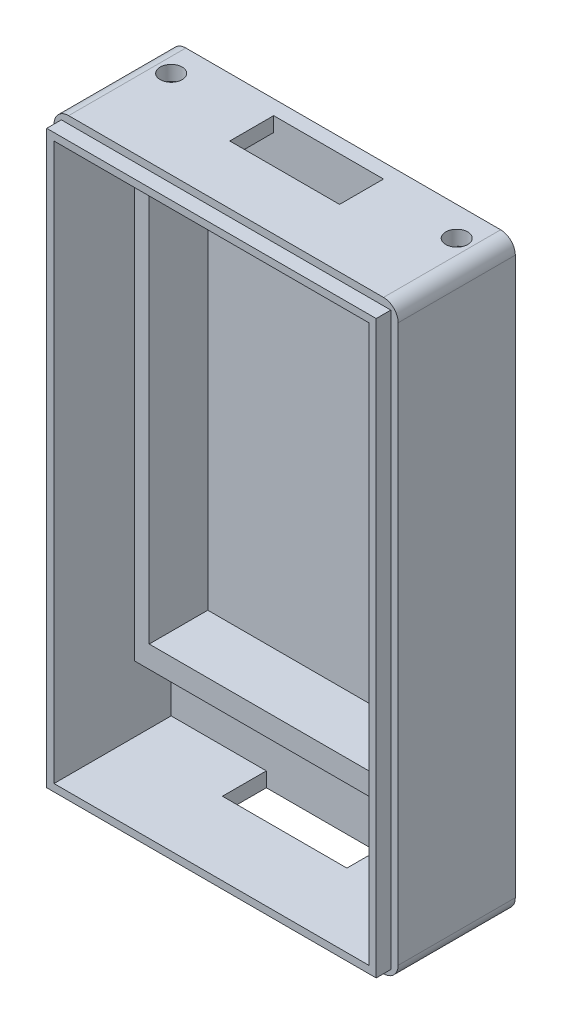
ISO-10303-21;
HEADER;
FILE_DESCRIPTION(('STEP AP214'),'2;1');
FILE_NAME('part.step','',(''),(''),'','','');
FILE_SCHEMA(('AUTOMOTIVE_DESIGN { 1 0 10303 214 1 1 1 1 }'));
ENDSEC;
DATA;
#1=APPLICATION_CONTEXT('core data for automotive mechanical design processes');
#2=APPLICATION_PROTOCOL_DEFINITION('international standard','automotive_design',2000,#1);
#3=PRODUCT_CONTEXT('',#1,'mechanical');
#4=PRODUCT('Part','Part','',(#3));
#5=PRODUCT_RELATED_PRODUCT_CATEGORY('part','',(#4));
#6=PRODUCT_DEFINITION_FORMATION('','',#4);
#7=PRODUCT_DEFINITION_CONTEXT('part definition',#1,'design');
#8=PRODUCT_DEFINITION('design','',#6,#7);
#9=PRODUCT_DEFINITION_SHAPE('','',#8);
#10=(LENGTH_UNIT() NAMED_UNIT(*) SI_UNIT(.MILLI.,.METRE.));
#11=(NAMED_UNIT(*) PLANE_ANGLE_UNIT() SI_UNIT($,.RADIAN.));
#12=(NAMED_UNIT(*) SI_UNIT($,.STERADIAN.) SOLID_ANGLE_UNIT());
#13=UNCERTAINTY_MEASURE_WITH_UNIT(LENGTH_MEASURE(1.E-05),#10,'distance_accuracy_value','');
#14=(GEOMETRIC_REPRESENTATION_CONTEXT(3) GLOBAL_UNCERTAINTY_ASSIGNED_CONTEXT((#13)) GLOBAL_UNIT_ASSIGNED_CONTEXT((#10,
#11,#12)) REPRESENTATION_CONTEXT('',''));
#15=CARTESIAN_POINT('',(0.,0.,0.));
#16=DIRECTION('',(0.,0.,1.));
#17=DIRECTION('',(1.,0.,0.));
#18=AXIS2_PLACEMENT_3D('',#15,#16,#17);
#19=CARTESIAN_POINT('',(23.5,40.,18.));
#20=DIRECTION('',(-1.,0.,0.));
#21=DIRECTION('',(0.,-1.,0.));
#22=AXIS2_PLACEMENT_3D('',#19,#20,#21);
#23=PLANE('',#22);
#24=DIRECTION('',(0.,1.,0.));
#25=VECTOR('',#24,1.);
#26=CARTESIAN_POINT('',(23.5,-40.,16.));
#27=LINE('',#26,#25);
#28=CARTESIAN_POINT('',(23.5,-38.,16.));
#29=VERTEX_POINT('',#28);
#30=CARTESIAN_POINT('',(23.5,38.,16.));
#31=VERTEX_POINT('',#30);
#32=EDGE_CURVE('E365',#29,#31,#27,.T.);
#33=ORIENTED_EDGE('',*,*,#32,.F.);
#34=DIRECTION('',(0.,0.,-1.));
#35=VECTOR('',#34,1.);
#36=CARTESIAN_POINT('',(23.5,-38.,18.));
#37=LINE('',#36,#35);
#38=CARTESIAN_POINT('',(23.5,-38.,0.));
#39=VERTEX_POINT('',#38);
#40=EDGE_CURVE('E522',#29,#39,#37,.T.);
#41=ORIENTED_EDGE('',*,*,#40,.T.);
#42=DIRECTION('',(0.,1.,0.));
#43=VECTOR('',#42,1.);
#44=CARTESIAN_POINT('',(23.5,40.,0.));
#45=LINE('',#44,#43);
#46=CARTESIAN_POINT('',(23.5,38.,0.));
#47=VERTEX_POINT('',#46);
#48=EDGE_CURVE('E474',#39,#47,#45,.T.);
#49=ORIENTED_EDGE('',*,*,#48,.T.);
#50=DIRECTION('',(0.,0.,-1.));
#51=VECTOR('',#50,1.);
#52=CARTESIAN_POINT('',(23.5,38.,18.));
#53=LINE('',#52,#51);
#54=EDGE_CURVE('E520',#47,#31,#53,.F.);
#55=ORIENTED_EDGE('',*,*,#54,.T.);
#56=EDGE_LOOP('',(#33,#41,#49,#55));
#57=FACE_BOUND('',#56,.T.);
#58=ADVANCED_FACE('F37',(#57),#23,.F.);
#59=CARTESIAN_POINT('',(-23.5,40.,18.));
#60=DIRECTION('',(0.,-1.,0.));
#61=DIRECTION('',(0.,0.,-1.));
#62=AXIS2_PLACEMENT_3D('',#59,#60,#61);
#63=PLANE('',#62);
#64=CARTESIAN_POINT('',(-19.5,40.,4.));
#65=DIRECTION('',(0.,1.,0.));
#66=DIRECTION('',(0.,0.,1.));
#67=AXIS2_PLACEMENT_3D('',#64,#65,#66);
#68=CIRCLE('',#67,1.5);
#69=CARTESIAN_POINT('',(-19.5,40.,5.5));
#70=VERTEX_POINT('',#69);
#71=EDGE_CURVE('E317',#70,#70,#68,.T.);
#72=ORIENTED_EDGE('',*,*,#71,.F.);
#73=EDGE_LOOP('',(#72));
#74=FACE_BOUND('',#73,.T.);
#75=CARTESIAN_POINT('',(19.5,40.,4.));
#76=DIRECTION('',(0.,1.,0.));
#77=DIRECTION('',(0.,0.,-1.));
#78=AXIS2_PLACEMENT_3D('',#75,#76,#77);
#79=CIRCLE('',#78,1.5);
#80=CARTESIAN_POINT('',(19.5,40.,2.5));
#81=VERTEX_POINT('',#80);
#82=EDGE_CURVE('E320',#81,#81,#79,.T.);
#83=ORIENTED_EDGE('',*,*,#82,.F.);
#84=EDGE_LOOP('',(#83));
#85=FACE_BOUND('',#84,.T.);
#86=DIRECTION('',(-1.,0.,0.));
#87=VECTOR('',#86,1.);
#88=CARTESIAN_POINT('',(-23.5,40.,8.));
#89=LINE('',#88,#87);
#90=CARTESIAN_POINT('',(7.5,40.,8.));
#91=VERTEX_POINT('',#90);
#92=CARTESIAN_POINT('',(-7.5,40.,8.));
#93=VERTEX_POINT('',#92);
#94=EDGE_CURVE('E497',#91,#93,#89,.T.);
#95=ORIENTED_EDGE('',*,*,#94,.T.);
#96=DIRECTION('',(0.,0.,-1.));
#97=VECTOR('',#96,1.);
#98=CARTESIAN_POINT('',(-7.5,40.,18.));
#99=LINE('',#98,#97);
#100=CARTESIAN_POINT('',(-7.5,40.,2.));
#101=VERTEX_POINT('',#100);
#102=EDGE_CURVE('E500',#93,#101,#99,.T.);
#103=ORIENTED_EDGE('',*,*,#102,.T.);
#104=DIRECTION('',(1.,0.,0.));
#105=VECTOR('',#104,1.);
#106=CARTESIAN_POINT('',(-23.5,40.,2.));
#107=LINE('',#106,#105);
#108=CARTESIAN_POINT('',(7.5,40.,2.));
#109=VERTEX_POINT('',#108);
#110=EDGE_CURVE('E491',#101,#109,#107,.T.);
#111=ORIENTED_EDGE('',*,*,#110,.T.);
#112=DIRECTION('',(0.,0.,1.));
#113=VECTOR('',#112,1.);
#114=CARTESIAN_POINT('',(7.5,40.,18.));
#115=LINE('',#114,#113);
#116=EDGE_CURVE('E494',#109,#91,#115,.T.);
#117=ORIENTED_EDGE('',*,*,#116,.T.);
#118=EDGE_LOOP('',(#95,#103,#111,#117));
#119=FACE_BOUND('',#118,.T.);
#120=DIRECTION('',(-1.,0.,0.));
#121=VECTOR('',#120,1.);
#122=CARTESIAN_POINT('',(-23.5,40.,0.));
#123=LINE('',#122,#121);
#124=CARTESIAN_POINT('',(21.5,40.,0.));
#125=VERTEX_POINT('',#124);
#126=CARTESIAN_POINT('',(-21.5,40.,0.));
#127=VERTEX_POINT('',#126);
#128=EDGE_CURVE('E483',#125,#127,#123,.T.);
#129=ORIENTED_EDGE('',*,*,#128,.T.);
#130=DIRECTION('',(0.,0.,-1.));
#131=VECTOR('',#130,1.);
#132=CARTESIAN_POINT('',(-21.5,40.,18.));
#133=LINE('',#132,#131);
#134=CARTESIAN_POINT('',(-21.5,40.,16.));
#135=VERTEX_POINT('',#134);
#136=EDGE_CURVE('E11',#127,#135,#133,.F.);
#137=ORIENTED_EDGE('',*,*,#136,.T.);
#138=DIRECTION('',(-1.,0.,0.));
#139=VECTOR('',#138,1.);
#140=CARTESIAN_POINT('',(-23.5,40.,16.));
#141=LINE('',#140,#139);
#142=CARTESIAN_POINT('',(21.5,40.,16.));
#143=VERTEX_POINT('',#142);
#144=EDGE_CURVE('E368',#143,#135,#141,.T.);
#145=ORIENTED_EDGE('',*,*,#144,.F.);
#146=DIRECTION('',(0.,0.,-1.));
#147=VECTOR('',#146,1.);
#148=CARTESIAN_POINT('',(21.5,40.,18.));
#149=LINE('',#148,#147);
#150=EDGE_CURVE('E45',#143,#125,#149,.T.);
#151=ORIENTED_EDGE('',*,*,#150,.T.);
#152=EDGE_LOOP('',(#129,#137,#145,#151));
#153=FACE_BOUND('',#152,.T.);
#154=ADVANCED_FACE('F553',(#74,#85,#119,#153),#63,.F.);
#155=CARTESIAN_POINT('',(-23.5,40.,18.));
#156=DIRECTION('',(1.,0.,0.));
#157=DIRECTION('',(0.,1.,0.));
#158=AXIS2_PLACEMENT_3D('',#155,#156,#157);
#159=PLANE('',#158);
#160=DIRECTION('',(0.,-1.,0.));
#161=VECTOR('',#160,1.);
#162=CARTESIAN_POINT('',(-23.5,40.,0.));
#163=LINE('',#162,#161);
#164=CARTESIAN_POINT('',(-23.5,38.,0.));
#165=VERTEX_POINT('',#164);
#166=CARTESIAN_POINT('',(-23.5,-38.,0.));
#167=VERTEX_POINT('',#166);
#168=EDGE_CURVE('E486',#165,#167,#163,.T.);
#169=ORIENTED_EDGE('',*,*,#168,.T.);
#170=DIRECTION('',(0.,0.,-1.));
#171=VECTOR('',#170,1.);
#172=CARTESIAN_POINT('',(-23.5,-38.,18.));
#173=LINE('',#172,#171);
#174=CARTESIAN_POINT('',(-23.5,-38.,16.));
#175=VERTEX_POINT('',#174);
#176=EDGE_CURVE('E52',#167,#175,#173,.F.);
#177=ORIENTED_EDGE('',*,*,#176,.T.);
#178=DIRECTION('',(0.,-1.,0.));
#179=VECTOR('',#178,1.);
#180=CARTESIAN_POINT('',(-23.5,-40.,16.));
#181=LINE('',#180,#179);
#182=CARTESIAN_POINT('',(-23.5,38.,16.));
#183=VERTEX_POINT('',#182);
#184=EDGE_CURVE('E370',#183,#175,#181,.T.);
#185=ORIENTED_EDGE('',*,*,#184,.F.);
#186=DIRECTION('',(0.,0.,-1.));
#187=VECTOR('',#186,1.);
#188=CARTESIAN_POINT('',(-23.5,38.,18.));
#189=LINE('',#188,#187);
#190=EDGE_CURVE('E545',#183,#165,#189,.T.);
#191=ORIENTED_EDGE('',*,*,#190,.T.);
#192=EDGE_LOOP('',(#169,#177,#185,#191));
#193=FACE_BOUND('',#192,.T.);
#194=ADVANCED_FACE('F564',(#193),#159,.F.);
#195=CARTESIAN_POINT('',(-23.5,-40.,18.));
#196=DIRECTION('',(0.,1.,0.));
#197=DIRECTION('',(0.,0.,1.));
#198=AXIS2_PLACEMENT_3D('',#195,#196,#197);
#199=PLANE('',#198);
#200=DIRECTION('',(-1.,0.,0.));
#201=VECTOR('',#200,1.);
#202=CARTESIAN_POINT('',(-23.5,-40.,2.));
#203=LINE('',#202,#201);
#204=CARTESIAN_POINT('',(8.50000000000001,-40.,2.));
#205=VERTEX_POINT('',#204);
#206=CARTESIAN_POINT('',(-8.49999999999999,-40.,2.));
#207=VERTEX_POINT('',#206);
#208=EDGE_CURVE('E307',#205,#207,#203,.T.);
#209=ORIENTED_EDGE('',*,*,#208,.T.);
#210=DIRECTION('',(0.,0.,1.));
#211=VECTOR('',#210,1.);
#212=CARTESIAN_POINT('',(-8.49999999999999,-40.,18.));
#213=LINE('',#212,#211);
#214=CARTESIAN_POINT('',(-8.49999999999999,-40.,8.));
#215=VERTEX_POINT('',#214);
#216=EDGE_CURVE('E310',#207,#215,#213,.T.);
#217=ORIENTED_EDGE('',*,*,#216,.T.);
#218=DIRECTION('',(1.,0.,0.));
#219=VECTOR('',#218,1.);
#220=CARTESIAN_POINT('',(-23.5,-40.,8.));
#221=LINE('',#220,#219);
#222=CARTESIAN_POINT('',(8.50000000000001,-40.,8.));
#223=VERTEX_POINT('',#222);
#224=EDGE_CURVE('E303',#215,#223,#221,.T.);
#225=ORIENTED_EDGE('',*,*,#224,.T.);
#226=DIRECTION('',(0.,0.,-1.));
#227=VECTOR('',#226,1.);
#228=CARTESIAN_POINT('',(8.50000000000001,-40.,18.));
#229=LINE('',#228,#227);
#230=EDGE_CURVE('E279',#223,#205,#229,.T.);
#231=ORIENTED_EDGE('',*,*,#230,.T.);
#232=EDGE_LOOP('',(#209,#217,#225,#231));
#233=FACE_BOUND('',#232,.T.);
#234=DIRECTION('',(1.,0.,0.));
#235=VECTOR('',#234,1.);
#236=CARTESIAN_POINT('',(-23.5,-40.,0.));
#237=LINE('',#236,#235);
#238=CARTESIAN_POINT('',(-21.5,-40.,0.));
#239=VERTEX_POINT('',#238);
#240=CARTESIAN_POINT('',(21.5,-40.,0.));
#241=VERTEX_POINT('',#240);
#242=EDGE_CURVE('E488',#239,#241,#237,.T.);
#243=ORIENTED_EDGE('',*,*,#242,.T.);
#244=DIRECTION('',(0.,0.,-1.));
#245=VECTOR('',#244,1.);
#246=CARTESIAN_POINT('',(21.5,-40.,18.));
#247=LINE('',#246,#245);
#248=CARTESIAN_POINT('',(21.5,-40.,16.));
#249=VERTEX_POINT('',#248);
#250=EDGE_CURVE('E536',#241,#249,#247,.F.);
#251=ORIENTED_EDGE('',*,*,#250,.T.);
#252=DIRECTION('',(1.,0.,0.));
#253=VECTOR('',#252,1.);
#254=CARTESIAN_POINT('',(-23.5,-40.,16.));
#255=LINE('',#254,#253);
#256=CARTESIAN_POINT('',(-21.5,-40.,16.));
#257=VERTEX_POINT('',#256);
#258=EDGE_CURVE('E356',#257,#249,#255,.T.);
#259=ORIENTED_EDGE('',*,*,#258,.F.);
#260=DIRECTION('',(0.,0.,-1.));
#261=VECTOR('',#260,1.);
#262=CARTESIAN_POINT('',(-21.5,-40.,18.));
#263=LINE('',#262,#261);
#264=EDGE_CURVE('E533',#257,#239,#263,.T.);
#265=ORIENTED_EDGE('',*,*,#264,.T.);
#266=EDGE_LOOP('',(#243,#251,#259,#265));
#267=FACE_BOUND('',#266,.T.);
#268=ADVANCED_FACE('F573',(#233,#267),#199,.F.);
#269=CARTESIAN_POINT('',(0.,0.,18.));
#270=DIRECTION('',(0.,0.,1.));
#271=DIRECTION('',(1.,0.,0.));
#272=AXIS2_PLACEMENT_3D('',#269,#270,#271);
#273=PLANE('',#272);
#274=DIRECTION('',(0.,1.,0.));
#275=VECTOR('',#274,1.);
#276=CARTESIAN_POINT('',(21.5,38.,18.));
#277=LINE('',#276,#275);
#278=CARTESIAN_POINT('',(21.5,-38.,18.));
#279=VERTEX_POINT('',#278);
#280=CARTESIAN_POINT('',(21.5,38.,18.));
#281=VERTEX_POINT('',#280);
#282=EDGE_CURVE('E445',#279,#281,#277,.T.);
#283=ORIENTED_EDGE('',*,*,#282,.F.);
#284=DIRECTION('',(1.,0.,0.));
#285=VECTOR('',#284,1.);
#286=CARTESIAN_POINT('',(-21.5,-38.,18.));
#287=LINE('',#286,#285);
#288=CARTESIAN_POINT('',(-21.5,-38.,18.));
#289=VERTEX_POINT('',#288);
#290=EDGE_CURVE('E450',#289,#279,#287,.T.);
#291=ORIENTED_EDGE('',*,*,#290,.F.);
#292=DIRECTION('',(0.,-1.,0.));
#293=VECTOR('',#292,1.);
#294=CARTESIAN_POINT('',(-21.5,38.,18.));
#295=LINE('',#294,#293);
#296=CARTESIAN_POINT('',(-21.5,38.,18.));
#297=VERTEX_POINT('',#296);
#298=EDGE_CURVE('E467',#297,#289,#295,.T.);
#299=ORIENTED_EDGE('',*,*,#298,.F.);
#300=DIRECTION('',(-1.,0.,0.));
#301=VECTOR('',#300,1.);
#302=CARTESIAN_POINT('',(-21.5,38.,18.));
#303=LINE('',#302,#301);
#304=EDGE_CURVE('E464',#281,#297,#303,.T.);
#305=ORIENTED_EDGE('',*,*,#304,.F.);
#306=EDGE_LOOP('',(#283,#291,#299,#305));
#307=FACE_BOUND('',#306,.T.);
#308=DIRECTION('',(1.,0.,0.));
#309=VECTOR('',#308,1.);
#310=CARTESIAN_POINT('',(22.5,-39.,18.));
#311=LINE('',#310,#309);
#312=CARTESIAN_POINT('',(-22.5,-39.,18.));
#313=VERTEX_POINT('',#312);
#314=CARTESIAN_POINT('',(22.5,-39.,18.));
#315=VERTEX_POINT('',#314);
#316=EDGE_CURVE('E334',#313,#315,#311,.T.);
#317=ORIENTED_EDGE('',*,*,#316,.T.);
#318=DIRECTION('',(0.,1.,0.));
#319=VECTOR('',#318,1.);
#320=CARTESIAN_POINT('',(22.5,39.,18.));
#321=LINE('',#320,#319);
#322=CARTESIAN_POINT('',(22.5,39.,18.));
#323=VERTEX_POINT('',#322);
#324=EDGE_CURVE('E329',#315,#323,#321,.T.);
#325=ORIENTED_EDGE('',*,*,#324,.T.);
#326=DIRECTION('',(-1.,0.,0.));
#327=VECTOR('',#326,1.);
#328=CARTESIAN_POINT('',(22.5,39.,18.));
#329=LINE('',#328,#327);
#330=CARTESIAN_POINT('',(-22.5,39.,18.));
#331=VERTEX_POINT('',#330);
#332=EDGE_CURVE('E346',#323,#331,#329,.T.);
#333=ORIENTED_EDGE('',*,*,#332,.T.);
#334=DIRECTION('',(0.,-1.,0.));
#335=VECTOR('',#334,1.);
#336=CARTESIAN_POINT('',(-22.5,39.,18.));
#337=LINE('',#336,#335);
#338=EDGE_CURVE('E349',#331,#313,#337,.T.);
#339=ORIENTED_EDGE('',*,*,#338,.T.);
#340=EDGE_LOOP('',(#317,#325,#333,#339));
#341=FACE_BOUND('',#340,.T.);
#342=ADVANCED_FACE('F771',(#307,#341),#273,.T.);
#343=CARTESIAN_POINT('',(-21.5,38.,2.));
#344=DIRECTION('',(0.,1.,0.));
#345=DIRECTION('',(0.,0.,1.));
#346=AXIS2_PLACEMENT_3D('',#343,#344,#345);
#347=PLANE('',#346);
#348=DIRECTION('',(0.,0.,-1.));
#349=VECTOR('',#348,1.);
#350=CARTESIAN_POINT('',(-18.5,38.,10.));
#351=LINE('',#350,#349);
#352=CARTESIAN_POINT('',(-18.5,38.,2.88196601125011));
#353=VERTEX_POINT('',#352);
#354=CARTESIAN_POINT('',(-18.5,38.,2.));
#355=VERTEX_POINT('',#354);
#356=EDGE_CURVE('E408',#353,#355,#351,.T.);
#357=ORIENTED_EDGE('',*,*,#356,.F.);
#358=CARTESIAN_POINT('',(-19.5,38.,4.));
#359=DIRECTION('',(0.,1.,0.));
#360=DIRECTION('',(0.,0.,1.));
#361=AXIS2_PLACEMENT_3D('',#358,#359,#360);
#362=CIRCLE('',#361,1.5);
#363=CARTESIAN_POINT('',(-18.5,38.,5.1180339887499));
#364=VERTEX_POINT('',#363);
#365=EDGE_CURVE('E326',#353,#364,#362,.T.);
#366=ORIENTED_EDGE('',*,*,#365,.T.);
#367=CARTESIAN_POINT('',(-18.5,38.,10.));
#368=VERTEX_POINT('',#367);
#369=EDGE_CURVE('E423',#368,#364,#351,.T.);
#370=ORIENTED_EDGE('',*,*,#369,.F.);
#371=DIRECTION('',(-1.,0.,0.));
#372=VECTOR('',#371,1.);
#373=CARTESIAN_POINT('',(-18.5,38.,10.));
#374=LINE('',#373,#372);
#375=CARTESIAN_POINT('',(-16.5,38.,10.));
#376=VERTEX_POINT('',#375);
#377=EDGE_CURVE('E406',#376,#368,#374,.T.);
#378=ORIENTED_EDGE('',*,*,#377,.F.);
#379=DIRECTION('',(0.,0.,-1.));
#380=VECTOR('',#379,1.);
#381=CARTESIAN_POINT('',(-16.5,38.,10.));
#382=LINE('',#381,#380);
#383=CARTESIAN_POINT('',(-16.5,38.,2.));
#384=VERTEX_POINT('',#383);
#385=EDGE_CURVE('E426',#376,#384,#382,.T.);
#386=ORIENTED_EDGE('',*,*,#385,.T.);
#387=DIRECTION('',(-1.,0.,0.));
#388=VECTOR('',#387,1.);
#389=CARTESIAN_POINT('',(-21.5,38.,2.));
#390=LINE('',#389,#388);
#391=CARTESIAN_POINT('',(-7.5,38.,2.));
#392=VERTEX_POINT('',#391);
#393=EDGE_CURVE('E456',#392,#384,#390,.T.);
#394=ORIENTED_EDGE('',*,*,#393,.F.);
#395=DIRECTION('',(0.,0.,-1.));
#396=VECTOR('',#395,1.);
#397=CARTESIAN_POINT('',(-7.5,38.,2.));
#398=LINE('',#397,#396);
#399=CARTESIAN_POINT('',(-7.5,38.,8.));
#400=VERTEX_POINT('',#399);
#401=EDGE_CURVE('E372',#400,#392,#398,.T.);
#402=ORIENTED_EDGE('',*,*,#401,.F.);
#403=DIRECTION('',(-1.,0.,0.));
#404=VECTOR('',#403,1.);
#405=CARTESIAN_POINT('',(-7.5,38.,8.));
#406=LINE('',#405,#404);
#407=CARTESIAN_POINT('',(7.5,38.,8.));
#408=VERTEX_POINT('',#407);
#409=EDGE_CURVE('E377',#408,#400,#406,.T.);
#410=ORIENTED_EDGE('',*,*,#409,.F.);
#411=DIRECTION('',(0.,0.,1.));
#412=VECTOR('',#411,1.);
#413=CARTESIAN_POINT('',(7.5,38.,2.));
#414=LINE('',#413,#412);
#415=CARTESIAN_POINT('',(7.5,38.,2.));
#416=VERTEX_POINT('',#415);
#417=EDGE_CURVE('E374',#416,#408,#414,.T.);
#418=ORIENTED_EDGE('',*,*,#417,.F.);
#419=CARTESIAN_POINT('',(16.5,38.,2.));
#420=VERTEX_POINT('',#419);
#421=EDGE_CURVE('E455',#420,#416,#390,.T.);
#422=ORIENTED_EDGE('',*,*,#421,.F.);
#423=DIRECTION('',(0.,0.,-1.));
#424=VECTOR('',#423,1.);
#425=CARTESIAN_POINT('',(16.5,38.,10.));
#426=LINE('',#425,#424);
#427=CARTESIAN_POINT('',(16.5,38.,10.));
#428=VERTEX_POINT('',#427);
#429=EDGE_CURVE('E434',#428,#420,#426,.T.);
#430=ORIENTED_EDGE('',*,*,#429,.F.);
#431=DIRECTION('',(-1.,0.,0.));
#432=VECTOR('',#431,1.);
#433=CARTESIAN_POINT('',(18.5,38.,10.));
#434=LINE('',#433,#432);
#435=CARTESIAN_POINT('',(18.5,38.,10.));
#436=VERTEX_POINT('',#435);
#437=EDGE_CURVE('E398',#436,#428,#434,.T.);
#438=ORIENTED_EDGE('',*,*,#437,.F.);
#439=DIRECTION('',(0.,0.,-1.));
#440=VECTOR('',#439,1.);
#441=CARTESIAN_POINT('',(18.5,38.,10.));
#442=LINE('',#441,#440);
#443=CARTESIAN_POINT('',(18.5,38.,5.11803398874989));
#444=VERTEX_POINT('',#443);
#445=EDGE_CURVE('E437',#436,#444,#442,.T.);
#446=ORIENTED_EDGE('',*,*,#445,.T.);
#447=CARTESIAN_POINT('',(19.5,38.,4.));
#448=DIRECTION('',(0.,1.,0.));
#449=DIRECTION('',(0.,0.,1.));
#450=AXIS2_PLACEMENT_3D('',#447,#448,#449);
#451=CIRCLE('',#450,1.5);
#452=CARTESIAN_POINT('',(18.5,38.,2.88196601125011));
#453=VERTEX_POINT('',#452);
#454=EDGE_CURVE('E316',#444,#453,#451,.T.);
#455=ORIENTED_EDGE('',*,*,#454,.T.);
#456=CARTESIAN_POINT('',(18.5,38.,2.));
#457=VERTEX_POINT('',#456);
#458=EDGE_CURVE('E436',#453,#457,#442,.T.);
#459=ORIENTED_EDGE('',*,*,#458,.T.);
#460=CARTESIAN_POINT('',(21.5,38.,2.));
#461=VERTEX_POINT('',#460);
#462=EDGE_CURVE('E451',#461,#457,#390,.T.);
#463=ORIENTED_EDGE('',*,*,#462,.F.);
#464=DIRECTION('',(0.,0.,1.));
#465=VECTOR('',#464,1.);
#466=CARTESIAN_POINT('',(21.5,38.,2.));
#467=LINE('',#466,#465);
#468=EDGE_CURVE('E462',#461,#281,#467,.T.);
#469=ORIENTED_EDGE('',*,*,#468,.T.);
#470=ORIENTED_EDGE('',*,*,#304,.T.);
#471=DIRECTION('',(0.,0.,1.));
#472=VECTOR('',#471,1.);
#473=CARTESIAN_POINT('',(-21.5,38.,2.));
#474=LINE('',#473,#472);
#475=CARTESIAN_POINT('',(-21.5,38.,2.));
#476=VERTEX_POINT('',#475);
#477=EDGE_CURVE('E477',#476,#297,#474,.T.);
#478=ORIENTED_EDGE('',*,*,#477,.F.);
#479=EDGE_CURVE('E449',#355,#476,#390,.T.);
#480=ORIENTED_EDGE('',*,*,#479,.F.);
#481=EDGE_LOOP('',(#357,#366,#370,#378,#386,#394,#402,#410,#418,#422,#430,#438,#446,#455,#459,
#463,#469,#470,#478,#480));
#482=FACE_BOUND('',#481,.T.);
#483=ADVANCED_FACE('F783',(#482),#347,.F.);
#484=CARTESIAN_POINT('',(0.,0.,2.));
#485=DIRECTION('',(0.,0.,1.));
#486=DIRECTION('',(1.,0.,0.));
#487=AXIS2_PLACEMENT_3D('',#484,#485,#486);
#488=PLANE('',#487);
#489=DIRECTION('',(1.,0.,0.));
#490=VECTOR('',#489,1.);
#491=CARTESIAN_POINT('',(-18.5,-26.,2.));
#492=LINE('',#491,#490);
#493=CARTESIAN_POINT('',(-18.5,-26.,2.));
#494=VERTEX_POINT('',#493);
#495=CARTESIAN_POINT('',(18.5,-26.,2.));
#496=VERTEX_POINT('',#495);
#497=EDGE_CURVE('E411',#494,#496,#492,.T.);
#498=ORIENTED_EDGE('',*,*,#497,.F.);
#499=DIRECTION('',(0.,-1.,0.));
#500=VECTOR('',#499,1.);
#501=CARTESIAN_POINT('',(-18.5,38.,2.));
#502=LINE('',#501,#500);
#503=EDGE_CURVE('E383',#355,#494,#502,.T.);
#504=ORIENTED_EDGE('',*,*,#503,.F.);
#505=ORIENTED_EDGE('',*,*,#479,.T.);
#506=DIRECTION('',(0.,-1.,0.));
#507=VECTOR('',#506,1.);
#508=CARTESIAN_POINT('',(-21.5,38.,2.));
#509=LINE('',#508,#507);
#510=CARTESIAN_POINT('',(-21.5,-38.,2.));
#511=VERTEX_POINT('',#510);
#512=EDGE_CURVE('E454',#476,#511,#509,.T.);
#513=ORIENTED_EDGE('',*,*,#512,.T.);
#514=DIRECTION('',(1.,0.,0.));
#515=VECTOR('',#514,1.);
#516=CARTESIAN_POINT('',(-21.5,-38.,2.));
#517=LINE('',#516,#515);
#518=CARTESIAN_POINT('',(-8.49999999999999,-38.,2.));
#519=VERTEX_POINT('',#518);
#520=EDGE_CURVE('E459',#511,#519,#517,.T.);
#521=ORIENTED_EDGE('',*,*,#520,.T.);
#522=DIRECTION('',(0.,1.,0.));
#523=VECTOR('',#522,1.);
#524=CARTESIAN_POINT('',(-8.49999999999999,-47.9999999999999,2.));
#525=LINE('',#524,#523);
#526=EDGE_CURVE('E301',#207,#519,#525,.T.);
#527=ORIENTED_EDGE('',*,*,#526,.F.);
#528=ORIENTED_EDGE('',*,*,#208,.F.);
#529=DIRECTION('',(0.,1.,0.));
#530=VECTOR('',#529,1.);
#531=CARTESIAN_POINT('',(8.50000000000001,-47.9999999999999,2.));
#532=LINE('',#531,#530);
#533=CARTESIAN_POINT('',(8.50000000000001,-38.,2.));
#534=VERTEX_POINT('',#533);
#535=EDGE_CURVE('E282',#205,#534,#532,.T.);
#536=ORIENTED_EDGE('',*,*,#535,.T.);
#537=CARTESIAN_POINT('',(21.5,-38.,2.));
#538=VERTEX_POINT('',#537);
#539=EDGE_CURVE('E296',#534,#538,#517,.T.);
#540=ORIENTED_EDGE('',*,*,#539,.T.);
#541=DIRECTION('',(0.,1.,0.));
#542=VECTOR('',#541,1.);
#543=CARTESIAN_POINT('',(21.5,38.,2.));
#544=LINE('',#543,#542);
#545=EDGE_CURVE('E446',#538,#461,#544,.T.);
#546=ORIENTED_EDGE('',*,*,#545,.T.);
#547=ORIENTED_EDGE('',*,*,#462,.T.);
#548=DIRECTION('',(0.,1.,0.));
#549=VECTOR('',#548,1.);
#550=CARTESIAN_POINT('',(18.5,38.,2.));
#551=LINE('',#550,#549);
#552=EDGE_CURVE('E413',#496,#457,#551,.T.);
#553=ORIENTED_EDGE('',*,*,#552,.F.);
#554=EDGE_LOOP('',(#498,#504,#505,#513,#521,#527,#528,#536,#540,#546,#547,#553));
#555=FACE_BOUND('',#554,.T.);
#556=ADVANCED_FACE('F894',(#555),#488,.T.);
#557=DIRECTION('',(-1.,0.,0.));
#558=VECTOR('',#557,1.);
#559=CARTESIAN_POINT('',(-16.5,-23.,2.));
#560=LINE('',#559,#558);
#561=CARTESIAN_POINT('',(16.5,-23.,2.));
#562=VERTEX_POINT('',#561);
#563=CARTESIAN_POINT('',(-16.5,-23.,2.));
#564=VERTEX_POINT('',#563);
#565=EDGE_CURVE('E418',#562,#564,#560,.T.);
#566=ORIENTED_EDGE('',*,*,#565,.F.);
#567=DIRECTION('',(0.,-1.,0.));
#568=VECTOR('',#567,1.);
#569=CARTESIAN_POINT('',(16.5,38.,2.));
#570=LINE('',#569,#568);
#571=EDGE_CURVE('E416',#420,#562,#570,.T.);
#572=ORIENTED_EDGE('',*,*,#571,.F.);
#573=ORIENTED_EDGE('',*,*,#421,.T.);
#574=DIRECTION('',(0.,-1.,0.));
#575=VECTOR('',#574,1.);
#576=CARTESIAN_POINT('',(7.5,49.,2.));
#577=LINE('',#576,#575);
#578=EDGE_CURVE('E386',#109,#416,#577,.T.);
#579=ORIENTED_EDGE('',*,*,#578,.F.);
#580=ORIENTED_EDGE('',*,*,#110,.F.);
#581=DIRECTION('',(0.,-1.,0.));
#582=VECTOR('',#581,1.);
#583=CARTESIAN_POINT('',(-7.5,49.,2.));
#584=LINE('',#583,#582);
#585=EDGE_CURVE('E380',#101,#392,#584,.T.);
#586=ORIENTED_EDGE('',*,*,#585,.T.);
#587=ORIENTED_EDGE('',*,*,#393,.T.);
#588=DIRECTION('',(0.,1.,0.));
#589=VECTOR('',#588,1.);
#590=CARTESIAN_POINT('',(-16.5,38.,2.));
#591=LINE('',#590,#589);
#592=EDGE_CURVE('E394',#564,#384,#591,.T.);
#593=ORIENTED_EDGE('',*,*,#592,.F.);
#594=EDGE_LOOP('',(#566,#572,#573,#579,#580,#586,#587,#593));
#595=FACE_BOUND('',#594,.T.);
#596=ADVANCED_FACE('F904',(#595),#488,.T.);
#597=CARTESIAN_POINT('',(0.,0.,0.));
#598=DIRECTION('',(0.,0.,1.));
#599=DIRECTION('',(1.,0.,0.));
#600=AXIS2_PLACEMENT_3D('',#597,#598,#599);
#601=PLANE('',#600);
#602=ORIENTED_EDGE('',*,*,#48,.F.);
#603=CARTESIAN_POINT('',(21.5,-38.,0.));
#604=DIRECTION('',(0.,0.,1.));
#605=DIRECTION('',(1.,0.,0.));
#606=AXIS2_PLACEMENT_3D('',#603,#604,#605);
#607=CIRCLE('',#606,2.);
#608=EDGE_CURVE('E531',#39,#241,#607,.F.);
#609=ORIENTED_EDGE('',*,*,#608,.T.);
#610=ORIENTED_EDGE('',*,*,#242,.F.);
#611=CARTESIAN_POINT('',(-21.5,-38.,0.));
#612=DIRECTION('',(0.,0.,1.));
#613=DIRECTION('',(1.,0.,0.));
#614=AXIS2_PLACEMENT_3D('',#611,#612,#613);
#615=CIRCLE('',#614,2.);
#616=EDGE_CURVE('E529',#239,#167,#615,.F.);
#617=ORIENTED_EDGE('',*,*,#616,.T.);
#618=ORIENTED_EDGE('',*,*,#168,.F.);
#619=CARTESIAN_POINT('',(-21.5,38.,0.));
#620=DIRECTION('',(0.,0.,1.));
#621=DIRECTION('',(1.,0.,0.));
#622=AXIS2_PLACEMENT_3D('',#619,#620,#621);
#623=CIRCLE('',#622,2.);
#624=EDGE_CURVE('E527',#165,#127,#623,.F.);
#625=ORIENTED_EDGE('',*,*,#624,.T.);
#626=ORIENTED_EDGE('',*,*,#128,.F.);
#627=CARTESIAN_POINT('',(21.5,38.,0.));
#628=DIRECTION('',(0.,0.,1.));
#629=DIRECTION('',(1.,0.,0.));
#630=AXIS2_PLACEMENT_3D('',#627,#628,#629);
#631=CIRCLE('',#630,2.);
#632=EDGE_CURVE('E525',#125,#47,#631,.F.);
#633=ORIENTED_EDGE('',*,*,#632,.T.);
#634=EDGE_LOOP('',(#602,#609,#610,#617,#618,#625,#626,#633));
#635=FACE_BOUND('',#634,.T.);
#636=ADVANCED_FACE('F559',(#635),#601,.F.);
#637=CARTESIAN_POINT('',(21.5,38.,2.));
#638=DIRECTION('',(1.,0.,0.));
#639=DIRECTION('',(0.,0.,-1.));
#640=AXIS2_PLACEMENT_3D('',#637,#638,#639);
#641=PLANE('',#640);
#642=ORIENTED_EDGE('',*,*,#282,.T.);
#643=ORIENTED_EDGE('',*,*,#468,.F.);
#644=ORIENTED_EDGE('',*,*,#545,.F.);
#645=DIRECTION('',(0.,0.,1.));
#646=VECTOR('',#645,1.);
#647=CARTESIAN_POINT('',(21.5,-38.,2.));
#648=LINE('',#647,#646);
#649=EDGE_CURVE('E472',#538,#279,#648,.T.);
#650=ORIENTED_EDGE('',*,*,#649,.T.);
#651=EDGE_LOOP('',(#642,#643,#644,#650));
#652=FACE_BOUND('',#651,.T.);
#653=ADVANCED_FACE('F935',(#652),#641,.F.);
#654=CARTESIAN_POINT('',(-21.5,-38.,2.));
#655=DIRECTION('',(0.,-1.,0.));
#656=DIRECTION('',(0.,0.,-1.));
#657=AXIS2_PLACEMENT_3D('',#654,#655,#656);
#658=PLANE('',#657);
#659=DIRECTION('',(1.,0.,0.));
#660=VECTOR('',#659,1.);
#661=CARTESIAN_POINT('',(-8.49999999999999,-38.,8.));
#662=LINE('',#661,#660);
#663=CARTESIAN_POINT('',(-8.49999999999999,-38.,8.));
#664=VERTEX_POINT('',#663);
#665=CARTESIAN_POINT('',(8.50000000000001,-38.,8.));
#666=VERTEX_POINT('',#665);
#667=EDGE_CURVE('E287',#664,#666,#662,.T.);
#668=ORIENTED_EDGE('',*,*,#667,.F.);
#669=DIRECTION('',(0.,0.,1.));
#670=VECTOR('',#669,1.);
#671=CARTESIAN_POINT('',(-8.49999999999999,-38.,2.));
#672=LINE('',#671,#670);
#673=EDGE_CURVE('E292',#519,#664,#672,.T.);
#674=ORIENTED_EDGE('',*,*,#673,.F.);
#675=ORIENTED_EDGE('',*,*,#520,.F.);
#676=DIRECTION('',(0.,0.,1.));
#677=VECTOR('',#676,1.);
#678=CARTESIAN_POINT('',(-21.5,-38.,2.));
#679=LINE('',#678,#677);
#680=EDGE_CURVE('E475',#511,#289,#679,.T.);
#681=ORIENTED_EDGE('',*,*,#680,.T.);
#682=ORIENTED_EDGE('',*,*,#290,.T.);
#683=ORIENTED_EDGE('',*,*,#649,.F.);
#684=ORIENTED_EDGE('',*,*,#539,.F.);
#685=DIRECTION('',(0.,0.,-1.));
#686=VECTOR('',#685,1.);
#687=CARTESIAN_POINT('',(8.50000000000001,-38.,2.));
#688=LINE('',#687,#686);
#689=EDGE_CURVE('E276',#666,#534,#688,.T.);
#690=ORIENTED_EDGE('',*,*,#689,.F.);
#691=EDGE_LOOP('',(#668,#674,#675,#681,#682,#683,#684,#690));
#692=FACE_BOUND('',#691,.T.);
#693=ADVANCED_FACE('F294',(#692),#658,.F.);
#694=CARTESIAN_POINT('',(-21.5,38.,2.));
#695=DIRECTION('',(-1.,0.,0.));
#696=DIRECTION('',(0.,0.,1.));
#697=AXIS2_PLACEMENT_3D('',#694,#695,#696);
#698=PLANE('',#697);
#699=ORIENTED_EDGE('',*,*,#298,.T.);
#700=ORIENTED_EDGE('',*,*,#680,.F.);
#701=ORIENTED_EDGE('',*,*,#512,.F.);
#702=ORIENTED_EDGE('',*,*,#477,.T.);
#703=EDGE_LOOP('',(#699,#700,#701,#702));
#704=FACE_BOUND('',#703,.T.);
#705=ADVANCED_FACE('F884',(#704),#698,.F.);
#706=CARTESIAN_POINT('',(-18.5,38.,10.));
#707=DIRECTION('',(1.,0.,0.));
#708=DIRECTION('',(0.,1.,0.));
#709=AXIS2_PLACEMENT_3D('',#706,#707,#708);
#710=PLANE('',#709);
#711=DIRECTION('',(0.,0.,1.));
#712=VECTOR('',#711,1.);
#713=CARTESIAN_POINT('',(-18.5,30.,10.));
#714=LINE('',#713,#712);
#715=CARTESIAN_POINT('',(-18.5,30.,2.88196601125011));
#716=VERTEX_POINT('',#715);
#717=CARTESIAN_POINT('',(-18.5,30.,5.1180339887499));
#718=VERTEX_POINT('',#717);
#719=EDGE_CURVE('E512',#716,#718,#714,.T.);
#720=ORIENTED_EDGE('',*,*,#719,.F.);
#721=DIRECTION('',(0.,1.,0.));
#722=VECTOR('',#721,1.);
#723=CARTESIAN_POINT('',(-18.5,30.,2.88196601125011));
#724=LINE('',#723,#722);
#725=EDGE_CURVE('E517',#716,#353,#724,.T.);
#726=ORIENTED_EDGE('',*,*,#725,.T.);
#727=ORIENTED_EDGE('',*,*,#356,.T.);
#728=ORIENTED_EDGE('',*,*,#503,.T.);
#729=DIRECTION('',(0.,0.,-1.));
#730=VECTOR('',#729,1.);
#731=CARTESIAN_POINT('',(-18.5,-26.,10.));
#732=LINE('',#731,#730);
#733=CARTESIAN_POINT('',(-18.5,-26.,10.));
#734=VERTEX_POINT('',#733);
#735=EDGE_CURVE('E443',#734,#494,#732,.T.);
#736=ORIENTED_EDGE('',*,*,#735,.F.);
#737=DIRECTION('',(0.,-1.,0.));
#738=VECTOR('',#737,1.);
#739=CARTESIAN_POINT('',(-18.5,38.,10.));
#740=LINE('',#739,#738);
#741=EDGE_CURVE('E390',#368,#734,#740,.T.);
#742=ORIENTED_EDGE('',*,*,#741,.F.);
#743=ORIENTED_EDGE('',*,*,#369,.T.);
#744=DIRECTION('',(0.,1.,0.));
#745=VECTOR('',#744,1.);
#746=CARTESIAN_POINT('',(-18.5,30.,5.1180339887499));
#747=LINE('',#746,#745);
#748=EDGE_CURVE('E514',#364,#718,#747,.F.);
#749=ORIENTED_EDGE('',*,*,#748,.T.);
#750=EDGE_LOOP('',(#720,#726,#727,#728,#736,#742,#743,#749));
#751=FACE_BOUND('',#750,.T.);
#752=ADVANCED_FACE('F874',(#751),#710,.F.);
#753=CARTESIAN_POINT('',(-18.5,-26.,10.));
#754=DIRECTION('',(0.,1.,0.));
#755=DIRECTION('',(-1.,0.,0.));
#756=AXIS2_PLACEMENT_3D('',#753,#754,#755);
#757=PLANE('',#756);
#758=ORIENTED_EDGE('',*,*,#497,.T.);
#759=DIRECTION('',(0.,0.,-1.));
#760=VECTOR('',#759,1.);
#761=CARTESIAN_POINT('',(18.5,-26.,10.));
#762=LINE('',#761,#760);
#763=CARTESIAN_POINT('',(18.5,-26.,10.));
#764=VERTEX_POINT('',#763);
#765=EDGE_CURVE('E440',#764,#496,#762,.T.);
#766=ORIENTED_EDGE('',*,*,#765,.F.);
#767=DIRECTION('',(1.,0.,0.));
#768=VECTOR('',#767,1.);
#769=CARTESIAN_POINT('',(-18.5,-26.,10.));
#770=LINE('',#769,#768);
#771=EDGE_CURVE('E393',#734,#764,#770,.T.);
#772=ORIENTED_EDGE('',*,*,#771,.F.);
#773=ORIENTED_EDGE('',*,*,#735,.T.);
#774=EDGE_LOOP('',(#758,#766,#772,#773));
#775=FACE_BOUND('',#774,.T.);
#776=ADVANCED_FACE('F864',(#775),#757,.F.);
#777=CARTESIAN_POINT('',(18.5,38.,10.));
#778=DIRECTION('',(-1.,0.,0.));
#779=DIRECTION('',(0.,-1.,0.));
#780=AXIS2_PLACEMENT_3D('',#777,#778,#779);
#781=PLANE('',#780);
#782=DIRECTION('',(0.,0.,1.));
#783=VECTOR('',#782,1.);
#784=CARTESIAN_POINT('',(18.5,30.,10.));
#785=LINE('',#784,#783);
#786=CARTESIAN_POINT('',(18.5,30.,2.88196601125011));
#787=VERTEX_POINT('',#786);
#788=CARTESIAN_POINT('',(18.5,30.,5.11803398874989));
#789=VERTEX_POINT('',#788);
#790=EDGE_CURVE('E503',#787,#789,#785,.T.);
#791=ORIENTED_EDGE('',*,*,#790,.T.);
#792=DIRECTION('',(0.,1.,0.));
#793=VECTOR('',#792,1.);
#794=CARTESIAN_POINT('',(18.5,30.,5.11803398874989));
#795=LINE('',#794,#793);
#796=EDGE_CURVE('E509',#789,#444,#795,.T.);
#797=ORIENTED_EDGE('',*,*,#796,.T.);
#798=ORIENTED_EDGE('',*,*,#445,.F.);
#799=DIRECTION('',(0.,1.,0.));
#800=VECTOR('',#799,1.);
#801=CARTESIAN_POINT('',(18.5,38.,10.));
#802=LINE('',#801,#800);
#803=EDGE_CURVE('E396',#764,#436,#802,.T.);
#804=ORIENTED_EDGE('',*,*,#803,.F.);
#805=ORIENTED_EDGE('',*,*,#765,.T.);
#806=ORIENTED_EDGE('',*,*,#552,.T.);
#807=ORIENTED_EDGE('',*,*,#458,.F.);
#808=DIRECTION('',(0.,1.,0.));
#809=VECTOR('',#808,1.);
#810=CARTESIAN_POINT('',(18.5,30.,2.88196601125011));
#811=LINE('',#810,#809);
#812=EDGE_CURVE('E506',#453,#787,#811,.F.);
#813=ORIENTED_EDGE('',*,*,#812,.T.);
#814=EDGE_LOOP('',(#791,#797,#798,#804,#805,#806,#807,#813));
#815=FACE_BOUND('',#814,.T.);
#816=ADVANCED_FACE('F854',(#815),#781,.F.);
#817=CARTESIAN_POINT('',(16.5,38.,10.));
#818=DIRECTION('',(1.,0.,0.));
#819=DIRECTION('',(0.,1.,0.));
#820=AXIS2_PLACEMENT_3D('',#817,#818,#819);
#821=PLANE('',#820);
#822=ORIENTED_EDGE('',*,*,#571,.T.);
#823=DIRECTION('',(0.,0.,-1.));
#824=VECTOR('',#823,1.);
#825=CARTESIAN_POINT('',(16.5,-23.,10.));
#826=LINE('',#825,#824);
#827=CARTESIAN_POINT('',(16.5,-23.,10.));
#828=VERTEX_POINT('',#827);
#829=EDGE_CURVE('E431',#828,#562,#826,.T.);
#830=ORIENTED_EDGE('',*,*,#829,.F.);
#831=DIRECTION('',(0.,-1.,0.));
#832=VECTOR('',#831,1.);
#833=CARTESIAN_POINT('',(16.5,38.,10.));
#834=LINE('',#833,#832);
#835=EDGE_CURVE('E400',#428,#828,#834,.T.);
#836=ORIENTED_EDGE('',*,*,#835,.F.);
#837=ORIENTED_EDGE('',*,*,#429,.T.);
#838=EDGE_LOOP('',(#822,#830,#836,#837));
#839=FACE_BOUND('',#838,.T.);
#840=ADVANCED_FACE('F844',(#839),#821,.F.);
#841=CARTESIAN_POINT('',(-16.5,-23.,10.));
#842=DIRECTION('',(0.,-1.,0.));
#843=DIRECTION('',(0.,0.,-1.));
#844=AXIS2_PLACEMENT_3D('',#841,#842,#843);
#845=PLANE('',#844);
#846=ORIENTED_EDGE('',*,*,#565,.T.);
#847=DIRECTION('',(0.,0.,-1.));
#848=VECTOR('',#847,1.);
#849=CARTESIAN_POINT('',(-16.5,-23.,10.));
#850=LINE('',#849,#848);
#851=CARTESIAN_POINT('',(-16.5,-23.,10.));
#852=VERTEX_POINT('',#851);
#853=EDGE_CURVE('E429',#852,#564,#850,.T.);
#854=ORIENTED_EDGE('',*,*,#853,.F.);
#855=DIRECTION('',(-1.,0.,0.));
#856=VECTOR('',#855,1.);
#857=CARTESIAN_POINT('',(-16.5,-23.,10.));
#858=LINE('',#857,#856);
#859=EDGE_CURVE('E402',#828,#852,#858,.T.);
#860=ORIENTED_EDGE('',*,*,#859,.F.);
#861=ORIENTED_EDGE('',*,*,#829,.T.);
#862=EDGE_LOOP('',(#846,#854,#860,#861));
#863=FACE_BOUND('',#862,.T.);
#864=ADVANCED_FACE('F834',(#863),#845,.F.);
#865=CARTESIAN_POINT('',(-16.5,38.,10.));
#866=DIRECTION('',(-1.,0.,0.));
#867=DIRECTION('',(0.,-1.,0.));
#868=AXIS2_PLACEMENT_3D('',#865,#866,#867);
#869=PLANE('',#868);
#870=ORIENTED_EDGE('',*,*,#592,.T.);
#871=ORIENTED_EDGE('',*,*,#385,.F.);
#872=DIRECTION('',(0.,1.,0.));
#873=VECTOR('',#872,1.);
#874=CARTESIAN_POINT('',(-16.5,38.,10.));
#875=LINE('',#874,#873);
#876=EDGE_CURVE('E404',#852,#376,#875,.T.);
#877=ORIENTED_EDGE('',*,*,#876,.F.);
#878=ORIENTED_EDGE('',*,*,#853,.T.);
#879=EDGE_LOOP('',(#870,#871,#877,#878));
#880=FACE_BOUND('',#879,.T.);
#881=ADVANCED_FACE('F824',(#880),#869,.F.);
#882=CARTESIAN_POINT('',(0.,0.,10.));
#883=DIRECTION('',(0.,0.,1.));
#884=DIRECTION('',(1.,0.,0.));
#885=AXIS2_PLACEMENT_3D('',#882,#883,#884);
#886=PLANE('',#885);
#887=ORIENTED_EDGE('',*,*,#741,.T.);
#888=ORIENTED_EDGE('',*,*,#771,.T.);
#889=ORIENTED_EDGE('',*,*,#803,.T.);
#890=ORIENTED_EDGE('',*,*,#437,.T.);
#891=ORIENTED_EDGE('',*,*,#835,.T.);
#892=ORIENTED_EDGE('',*,*,#859,.T.);
#893=ORIENTED_EDGE('',*,*,#876,.T.);
#894=ORIENTED_EDGE('',*,*,#377,.T.);
#895=EDGE_LOOP('',(#887,#888,#889,#890,#891,#892,#893,#894));
#896=FACE_BOUND('',#895,.T.);
#897=ADVANCED_FACE('F813',(#896),#886,.T.);
#898=CARTESIAN_POINT('',(-7.5,49.,2.));
#899=DIRECTION('',(-1.,0.,0.));
#900=DIRECTION('',(0.,0.,1.));
#901=AXIS2_PLACEMENT_3D('',#898,#899,#900);
#902=PLANE('',#901);
#903=DIRECTION('',(0.,-1.,0.));
#904=VECTOR('',#903,1.);
#905=CARTESIAN_POINT('',(-7.5,49.,8.));
#906=LINE('',#905,#904);
#907=EDGE_CURVE('E381',#93,#400,#906,.T.);
#908=ORIENTED_EDGE('',*,*,#907,.T.);
#909=ORIENTED_EDGE('',*,*,#401,.T.);
#910=ORIENTED_EDGE('',*,*,#585,.F.);
#911=ORIENTED_EDGE('',*,*,#102,.F.);
#912=EDGE_LOOP('',(#908,#909,#910,#911));
#913=FACE_BOUND('',#912,.T.);
#914=ADVANCED_FACE('F803',(#913),#902,.F.);
#915=CARTESIAN_POINT('',(-7.5,49.,8.));
#916=DIRECTION('',(0.,0.,1.));
#917=DIRECTION('',(1.,0.,0.));
#918=AXIS2_PLACEMENT_3D('',#915,#916,#917);
#919=PLANE('',#918);
#920=DIRECTION('',(0.,-1.,0.));
#921=VECTOR('',#920,1.);
#922=CARTESIAN_POINT('',(7.5,49.,8.));
#923=LINE('',#922,#921);
#924=EDGE_CURVE('E384',#91,#408,#923,.T.);
#925=ORIENTED_EDGE('',*,*,#924,.T.);
#926=ORIENTED_EDGE('',*,*,#409,.T.);
#927=ORIENTED_EDGE('',*,*,#907,.F.);
#928=ORIENTED_EDGE('',*,*,#94,.F.);
#929=EDGE_LOOP('',(#925,#926,#927,#928));
#930=FACE_BOUND('',#929,.T.);
#931=ADVANCED_FACE('F794',(#930),#919,.F.);
#932=CARTESIAN_POINT('',(7.5,49.,2.));
#933=DIRECTION('',(1.,0.,0.));
#934=DIRECTION('',(0.,0.,-1.));
#935=AXIS2_PLACEMENT_3D('',#932,#933,#934);
#936=PLANE('',#935);
#937=ORIENTED_EDGE('',*,*,#578,.T.);
#938=ORIENTED_EDGE('',*,*,#417,.T.);
#939=ORIENTED_EDGE('',*,*,#924,.F.);
#940=ORIENTED_EDGE('',*,*,#116,.F.);
#941=EDGE_LOOP('',(#937,#938,#939,#940));
#942=FACE_BOUND('',#941,.T.);
#943=ADVANCED_FACE('F739',(#942),#936,.F.);
#944=CARTESIAN_POINT('',(0.,0.,16.));
#945=DIRECTION('',(0.,0.,1.));
#946=DIRECTION('',(1.,0.,0.));
#947=AXIS2_PLACEMENT_3D('',#944,#945,#946);
#948=PLANE('',#947);
#949=DIRECTION('',(1.,0.,0.));
#950=VECTOR('',#949,1.);
#951=CARTESIAN_POINT('',(22.5,-39.,16.));
#952=LINE('',#951,#950);
#953=CARTESIAN_POINT('',(-22.5,-39.,16.));
#954=VERTEX_POINT('',#953);
#955=CARTESIAN_POINT('',(22.5,-39.,16.));
#956=VERTEX_POINT('',#955);
#957=EDGE_CURVE('E340',#954,#956,#952,.T.);
#958=ORIENTED_EDGE('',*,*,#957,.F.);
#959=DIRECTION('',(0.,-1.,0.));
#960=VECTOR('',#959,1.);
#961=CARTESIAN_POINT('',(-22.5,39.,16.));
#962=LINE('',#961,#960);
#963=CARTESIAN_POINT('',(-22.5,39.,16.));
#964=VERTEX_POINT('',#963);
#965=EDGE_CURVE('E337',#964,#954,#962,.T.);
#966=ORIENTED_EDGE('',*,*,#965,.F.);
#967=DIRECTION('',(-1.,0.,0.));
#968=VECTOR('',#967,1.);
#969=CARTESIAN_POINT('',(22.5,39.,16.));
#970=LINE('',#969,#968);
#971=CARTESIAN_POINT('',(22.5,39.,16.));
#972=VERTEX_POINT('',#971);
#973=EDGE_CURVE('E333',#972,#964,#970,.T.);
#974=ORIENTED_EDGE('',*,*,#973,.F.);
#975=DIRECTION('',(0.,1.,0.));
#976=VECTOR('',#975,1.);
#977=CARTESIAN_POINT('',(22.5,39.,16.));
#978=LINE('',#977,#976);
#979=EDGE_CURVE('E330',#956,#972,#978,.T.);
#980=ORIENTED_EDGE('',*,*,#979,.F.);
#981=EDGE_LOOP('',(#958,#966,#974,#980));
#982=FACE_BOUND('',#981,.T.);
#983=ORIENTED_EDGE('',*,*,#258,.T.);
#984=CARTESIAN_POINT('',(21.5,-38.,16.));
#985=DIRECTION('',(0.,0.,1.));
#986=DIRECTION('',(1.,0.,0.));
#987=AXIS2_PLACEMENT_3D('',#984,#985,#986);
#988=CIRCLE('',#987,2.);
#989=EDGE_CURVE('E543',#249,#29,#988,.T.);
#990=ORIENTED_EDGE('',*,*,#989,.T.);
#991=ORIENTED_EDGE('',*,*,#32,.T.);
#992=CARTESIAN_POINT('',(21.5,38.,16.));
#993=DIRECTION('',(0.,0.,1.));
#994=DIRECTION('',(1.,0.,0.));
#995=AXIS2_PLACEMENT_3D('',#992,#993,#994);
#996=CIRCLE('',#995,2.);
#997=EDGE_CURVE('E538',#31,#143,#996,.T.);
#998=ORIENTED_EDGE('',*,*,#997,.T.);
#999=ORIENTED_EDGE('',*,*,#144,.T.);
#1000=CARTESIAN_POINT('',(-21.5,38.,16.));
#1001=DIRECTION('',(0.,0.,1.));
#1002=DIRECTION('',(1.,0.,0.));
#1003=AXIS2_PLACEMENT_3D('',#1000,#1001,#1002);
#1004=CIRCLE('',#1003,2.);
#1005=EDGE_CURVE('E59',#135,#183,#1004,.T.);
#1006=ORIENTED_EDGE('',*,*,#1005,.T.);
#1007=ORIENTED_EDGE('',*,*,#184,.T.);
#1008=CARTESIAN_POINT('',(-21.5,-38.,16.));
#1009=DIRECTION('',(0.,0.,1.));
#1010=DIRECTION('',(1.,0.,0.));
#1011=AXIS2_PLACEMENT_3D('',#1008,#1009,#1010);
#1012=CIRCLE('',#1011,2.);
#1013=EDGE_CURVE('E541',#175,#257,#1012,.T.);
#1014=ORIENTED_EDGE('',*,*,#1013,.T.);
#1015=EDGE_LOOP('',(#983,#990,#991,#998,#999,#1006,#1007,#1014));
#1016=FACE_BOUND('',#1015,.T.);
#1017=ADVANCED_FACE('F566',(#982,#1016),#948,.T.);
#1018=CARTESIAN_POINT('',(22.5,39.,16.));
#1019=DIRECTION('',(1.,0.,0.));
#1020=DIRECTION('',(0.,1.,0.));
#1021=AXIS2_PLACEMENT_3D('',#1018,#1019,#1020);
#1022=PLANE('',#1021);
#1023=ORIENTED_EDGE('',*,*,#324,.F.);
#1024=DIRECTION('',(0.,0.,1.));
#1025=VECTOR('',#1024,1.);
#1026=CARTESIAN_POINT('',(22.5,-39.,16.));
#1027=LINE('',#1026,#1025);
#1028=EDGE_CURVE('E354',#956,#315,#1027,.T.);
#1029=ORIENTED_EDGE('',*,*,#1028,.F.);
#1030=ORIENTED_EDGE('',*,*,#979,.T.);
#1031=DIRECTION('',(0.,0.,1.));
#1032=VECTOR('',#1031,1.);
#1033=CARTESIAN_POINT('',(22.5,39.,16.));
#1034=LINE('',#1033,#1032);
#1035=EDGE_CURVE('E343',#972,#323,#1034,.T.);
#1036=ORIENTED_EDGE('',*,*,#1035,.T.);
#1037=EDGE_LOOP('',(#1023,#1029,#1030,#1036));
#1038=FACE_BOUND('',#1037,.T.);
#1039=ADVANCED_FACE('F720',(#1038),#1022,.T.);
#1040=CARTESIAN_POINT('',(22.5,-39.,16.));
#1041=DIRECTION('',(0.,-1.,0.));
#1042=DIRECTION('',(1.,0.,0.));
#1043=AXIS2_PLACEMENT_3D('',#1040,#1041,#1042);
#1044=PLANE('',#1043);
#1045=ORIENTED_EDGE('',*,*,#316,.F.);
#1046=DIRECTION('',(0.,0.,1.));
#1047=VECTOR('',#1046,1.);
#1048=CARTESIAN_POINT('',(-22.5,-39.,16.));
#1049=LINE('',#1048,#1047);
#1050=EDGE_CURVE('E357',#954,#313,#1049,.T.);
#1051=ORIENTED_EDGE('',*,*,#1050,.F.);
#1052=ORIENTED_EDGE('',*,*,#957,.T.);
#1053=ORIENTED_EDGE('',*,*,#1028,.T.);
#1054=EDGE_LOOP('',(#1045,#1051,#1052,#1053));
#1055=FACE_BOUND('',#1054,.T.);
#1056=ADVANCED_FACE('F710',(#1055),#1044,.T.);
#1057=CARTESIAN_POINT('',(-22.5,39.,16.));
#1058=DIRECTION('',(-1.,0.,0.));
#1059=DIRECTION('',(0.,-1.,0.));
#1060=AXIS2_PLACEMENT_3D('',#1057,#1058,#1059);
#1061=PLANE('',#1060);
#1062=ORIENTED_EDGE('',*,*,#338,.F.);
#1063=DIRECTION('',(0.,0.,1.));
#1064=VECTOR('',#1063,1.);
#1065=CARTESIAN_POINT('',(-22.5,39.,16.));
#1066=LINE('',#1065,#1064);
#1067=EDGE_CURVE('E359',#964,#331,#1066,.T.);
#1068=ORIENTED_EDGE('',*,*,#1067,.F.);
#1069=ORIENTED_EDGE('',*,*,#965,.T.);
#1070=ORIENTED_EDGE('',*,*,#1050,.T.);
#1071=EDGE_LOOP('',(#1062,#1068,#1069,#1070));
#1072=FACE_BOUND('',#1071,.T.);
#1073=ADVANCED_FACE('F700',(#1072),#1061,.T.);
#1074=CARTESIAN_POINT('',(22.5,39.,16.));
#1075=DIRECTION('',(0.,1.,0.));
#1076=DIRECTION('',(-1.,0.,0.));
#1077=AXIS2_PLACEMENT_3D('',#1074,#1075,#1076);
#1078=PLANE('',#1077);
#1079=ORIENTED_EDGE('',*,*,#332,.F.);
#1080=ORIENTED_EDGE('',*,*,#1035,.F.);
#1081=ORIENTED_EDGE('',*,*,#973,.T.);
#1082=ORIENTED_EDGE('',*,*,#1067,.T.);
#1083=EDGE_LOOP('',(#1079,#1080,#1081,#1082));
#1084=FACE_BOUND('',#1083,.T.);
#1085=ADVANCED_FACE('F690',(#1084),#1078,.T.);
#1086=CARTESIAN_POINT('',(19.5,30.,4.));
#1087=DIRECTION('',(0.,1.,0.));
#1088=DIRECTION('',(0.,0.,1.));
#1089=AXIS2_PLACEMENT_3D('',#1086,#1087,#1088);
#1090=CYLINDRICAL_SURFACE('',#1089,1.5);
#1091=ORIENTED_EDGE('',*,*,#82,.T.);
#1092=EDGE_LOOP('',(#1091));
#1093=FACE_BOUND('',#1092,.T.);
#1094=CARTESIAN_POINT('',(19.5,30.,4.));
#1095=DIRECTION('',(0.,1.,0.));
#1096=DIRECTION('',(0.,0.,-1.));
#1097=AXIS2_PLACEMENT_3D('',#1094,#1095,#1096);
#1098=CIRCLE('',#1097,1.5);
#1099=EDGE_CURVE('E313',#787,#789,#1098,.T.);
#1100=ORIENTED_EDGE('',*,*,#1099,.F.);
#1101=ORIENTED_EDGE('',*,*,#812,.F.);
#1102=ORIENTED_EDGE('',*,*,#454,.F.);
#1103=ORIENTED_EDGE('',*,*,#796,.F.);
#1104=EDGE_LOOP('',(#1100,#1101,#1102,#1103));
#1105=FACE_BOUND('',#1104,.T.);
#1106=ADVANCED_FACE('F680',(#1093,#1105),#1090,.F.);
#1107=CARTESIAN_POINT('',(19.5,30.,4.));
#1108=DIRECTION('',(0.,-1.,0.));
#1109=DIRECTION('',(0.,0.,-1.));
#1110=AXIS2_PLACEMENT_3D('',#1107,#1108,#1109);
#1111=PLANE('',#1110);
#1112=ORIENTED_EDGE('',*,*,#1099,.T.);
#1113=ORIENTED_EDGE('',*,*,#790,.F.);
#1114=EDGE_LOOP('',(#1112,#1113));
#1115=FACE_BOUND('',#1114,.T.);
#1116=ADVANCED_FACE('F670',(#1115),#1111,.F.);
#1117=CARTESIAN_POINT('',(-19.5,30.,4.));
#1118=DIRECTION('',(0.,1.,0.));
#1119=DIRECTION('',(0.,0.,1.));
#1120=AXIS2_PLACEMENT_3D('',#1117,#1118,#1119);
#1121=CYLINDRICAL_SURFACE('',#1120,1.5);
#1122=ORIENTED_EDGE('',*,*,#71,.T.);
#1123=EDGE_LOOP('',(#1122));
#1124=FACE_BOUND('',#1123,.T.);
#1125=CARTESIAN_POINT('',(-19.5,30.,4.));
#1126=DIRECTION('',(0.,1.,0.));
#1127=DIRECTION('',(0.,0.,1.));
#1128=AXIS2_PLACEMENT_3D('',#1125,#1126,#1127);
#1129=CIRCLE('',#1128,1.5);
#1130=EDGE_CURVE('E314',#718,#716,#1129,.T.);
#1131=ORIENTED_EDGE('',*,*,#1130,.F.);
#1132=ORIENTED_EDGE('',*,*,#748,.F.);
#1133=ORIENTED_EDGE('',*,*,#365,.F.);
#1134=ORIENTED_EDGE('',*,*,#725,.F.);
#1135=EDGE_LOOP('',(#1131,#1132,#1133,#1134));
#1136=FACE_BOUND('',#1135,.T.);
#1137=ADVANCED_FACE('F660',(#1124,#1136),#1121,.F.);
#1138=CARTESIAN_POINT('',(-19.5,30.,4.));
#1139=DIRECTION('',(0.,1.,0.));
#1140=DIRECTION('',(0.,0.,1.));
#1141=AXIS2_PLACEMENT_3D('',#1138,#1139,#1140);
#1142=PLANE('',#1141);
#1143=ORIENTED_EDGE('',*,*,#719,.T.);
#1144=ORIENTED_EDGE('',*,*,#1130,.T.);
#1145=EDGE_LOOP('',(#1143,#1144));
#1146=FACE_BOUND('',#1145,.T.);
#1147=ADVANCED_FACE('F649',(#1146),#1142,.T.);
#1148=CARTESIAN_POINT('',(-8.49999999999999,-47.9999999999999,2.));
#1149=DIRECTION('',(-1.,0.,0.));
#1150=DIRECTION('',(0.,0.,1.));
#1151=AXIS2_PLACEMENT_3D('',#1148,#1149,#1150);
#1152=PLANE('',#1151);
#1153=ORIENTED_EDGE('',*,*,#526,.T.);
#1154=ORIENTED_EDGE('',*,*,#673,.T.);
#1155=DIRECTION('',(0.,1.,0.));
#1156=VECTOR('',#1155,1.);
#1157=CARTESIAN_POINT('',(-8.49999999999999,-47.9999999999999,8.));
#1158=LINE('',#1157,#1156);
#1159=EDGE_CURVE('E283',#215,#664,#1158,.T.);
#1160=ORIENTED_EDGE('',*,*,#1159,.F.);
#1161=ORIENTED_EDGE('',*,*,#216,.F.);
#1162=EDGE_LOOP('',(#1153,#1154,#1160,#1161));
#1163=FACE_BOUND('',#1162,.T.);
#1164=ADVANCED_FACE('F640',(#1163),#1152,.F.);
#1165=CARTESIAN_POINT('',(8.50000000000001,-47.9999999999999,2.));
#1166=DIRECTION('',(1.,0.,0.));
#1167=DIRECTION('',(0.,0.,-1.));
#1168=AXIS2_PLACEMENT_3D('',#1165,#1166,#1167);
#1169=PLANE('',#1168);
#1170=DIRECTION('',(0.,1.,0.));
#1171=VECTOR('',#1170,1.);
#1172=CARTESIAN_POINT('',(8.50000000000001,-47.9999999999999,8.));
#1173=LINE('',#1172,#1171);
#1174=EDGE_CURVE('E271',#223,#666,#1173,.T.);
#1175=ORIENTED_EDGE('',*,*,#1174,.T.);
#1176=ORIENTED_EDGE('',*,*,#689,.T.);
#1177=ORIENTED_EDGE('',*,*,#535,.F.);
#1178=ORIENTED_EDGE('',*,*,#230,.F.);
#1179=EDGE_LOOP('',(#1175,#1176,#1177,#1178));
#1180=FACE_BOUND('',#1179,.T.);
#1181=ADVANCED_FACE('F273',(#1180),#1169,.F.);
#1182=CARTESIAN_POINT('',(-8.49999999999999,-47.9999999999999,8.));
#1183=DIRECTION('',(0.,0.,1.));
#1184=DIRECTION('',(1.,0.,0.));
#1185=AXIS2_PLACEMENT_3D('',#1182,#1183,#1184);
#1186=PLANE('',#1185);
#1187=ORIENTED_EDGE('',*,*,#1159,.T.);
#1188=ORIENTED_EDGE('',*,*,#667,.T.);
#1189=ORIENTED_EDGE('',*,*,#1174,.F.);
#1190=ORIENTED_EDGE('',*,*,#224,.F.);
#1191=EDGE_LOOP('',(#1187,#1188,#1189,#1190));
#1192=FACE_BOUND('',#1191,.T.);
#1193=ADVANCED_FACE('F288',(#1192),#1186,.F.);
#1194=CARTESIAN_POINT('',(21.5,-38.,18.));
#1195=DIRECTION('',(0.,0.,-1.));
#1196=DIRECTION('',(-1.,0.,0.));
#1197=AXIS2_PLACEMENT_3D('',#1194,#1195,#1196);
#1198=CYLINDRICAL_SURFACE('',#1197,2.);
#1199=ORIENTED_EDGE('',*,*,#989,.F.);
#1200=ORIENTED_EDGE('',*,*,#250,.F.);
#1201=ORIENTED_EDGE('',*,*,#608,.F.);
#1202=ORIENTED_EDGE('',*,*,#40,.F.);
#1203=EDGE_LOOP('',(#1199,#1200,#1201,#1202));
#1204=FACE_BOUND('',#1203,.T.);
#1205=ADVANCED_FACE('F578',(#1204),#1198,.T.);
#1206=CARTESIAN_POINT('',(-21.5,-38.,18.));
#1207=DIRECTION('',(0.,0.,-1.));
#1208=DIRECTION('',(-1.,0.,0.));
#1209=AXIS2_PLACEMENT_3D('',#1206,#1207,#1208);
#1210=CYLINDRICAL_SURFACE('',#1209,2.);
#1211=ORIENTED_EDGE('',*,*,#1013,.F.);
#1212=ORIENTED_EDGE('',*,*,#176,.F.);
#1213=ORIENTED_EDGE('',*,*,#616,.F.);
#1214=ORIENTED_EDGE('',*,*,#264,.F.);
#1215=EDGE_LOOP('',(#1211,#1212,#1213,#1214));
#1216=FACE_BOUND('',#1215,.T.);
#1217=ADVANCED_FACE('F570',(#1216),#1210,.T.);
#1218=CARTESIAN_POINT('',(-21.5,38.,18.));
#1219=DIRECTION('',(0.,0.,-1.));
#1220=DIRECTION('',(-1.,0.,0.));
#1221=AXIS2_PLACEMENT_3D('',#1218,#1219,#1220);
#1222=CYLINDRICAL_SURFACE('',#1221,2.);
#1223=ORIENTED_EDGE('',*,*,#1005,.F.);
#1224=ORIENTED_EDGE('',*,*,#136,.F.);
#1225=ORIENTED_EDGE('',*,*,#624,.F.);
#1226=ORIENTED_EDGE('',*,*,#190,.F.);
#1227=EDGE_LOOP('',(#1223,#1224,#1225,#1226));
#1228=FACE_BOUND('',#1227,.T.);
#1229=ADVANCED_FACE('F563',(#1228),#1222,.T.);
#1230=CARTESIAN_POINT('',(21.5,38.,18.));
#1231=DIRECTION('',(0.,0.,-1.));
#1232=DIRECTION('',(-1.,0.,0.));
#1233=AXIS2_PLACEMENT_3D('',#1230,#1231,#1232);
#1234=CYLINDRICAL_SURFACE('',#1233,2.);
#1235=ORIENTED_EDGE('',*,*,#997,.F.);
#1236=ORIENTED_EDGE('',*,*,#54,.F.);
#1237=ORIENTED_EDGE('',*,*,#632,.F.);
#1238=ORIENTED_EDGE('',*,*,#150,.F.);
#1239=EDGE_LOOP('',(#1235,#1236,#1237,#1238));
#1240=FACE_BOUND('',#1239,.T.);
#1241=ADVANCED_FACE('F39',(#1240),#1234,.T.);
#1242=CLOSED_SHELL('',(#58,#154,#194,#268,#342,#483,#556,#596,#636,#653,#693,#705,#752,#776,
#816,#840,#864,#881,#897,#914,#931,#943,#1017,#1039,#1056,#1073,#1085,#1106,#1116,#1137,#1147,
#1164,#1181,#1193,#1205,#1217,#1229,#1241));
#1243=MANIFOLD_SOLID_BREP('B2',#1242);
#1244=ADVANCED_BREP_SHAPE_REPRESENTATION('',(#18,#1243),#14);
#1245=SHAPE_DEFINITION_REPRESENTATION(#9,#1244);
ENDSEC;
END-ISO-10303-21;
